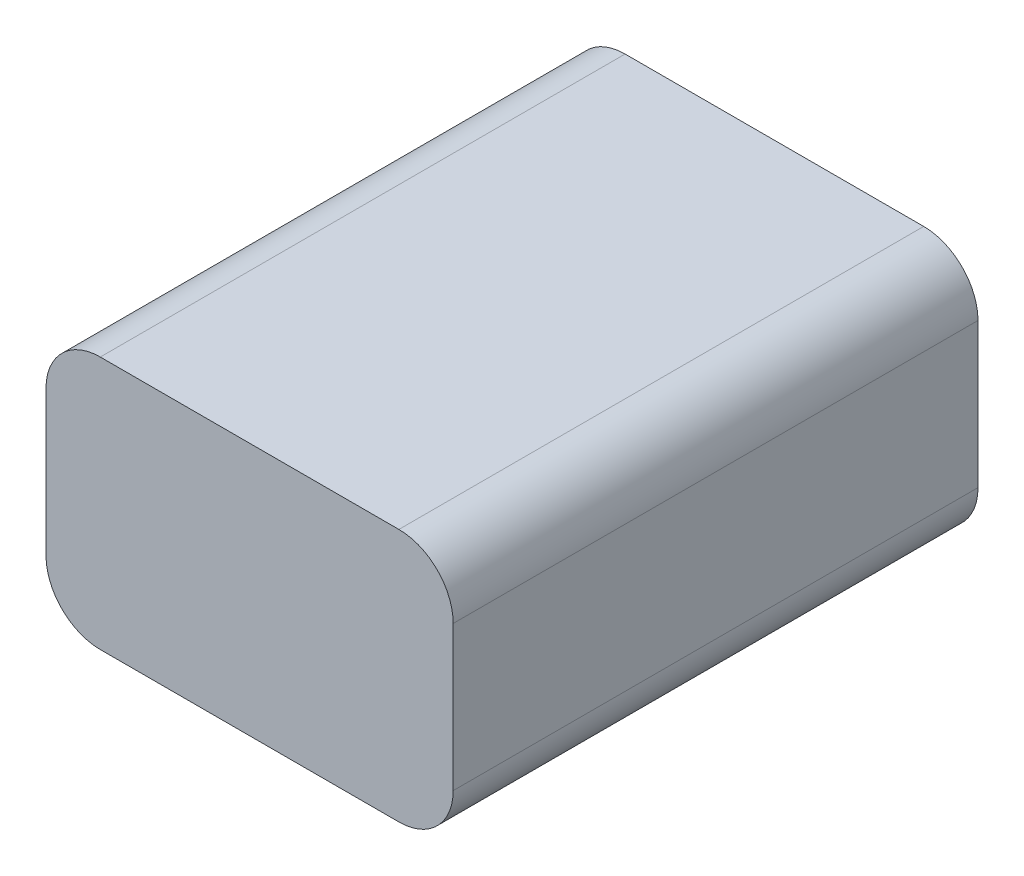
ISO-10303-21;
HEADER;
FILE_DESCRIPTION(('STEP AP214'),'2;1');
FILE_NAME('part.step','',(''),(''),'','','');
FILE_SCHEMA(('AUTOMOTIVE_DESIGN { 1 0 10303 214 1 1 1 1 }'));
ENDSEC;
DATA;
#1=APPLICATION_CONTEXT('core data for automotive mechanical design processes');
#2=APPLICATION_PROTOCOL_DEFINITION('international standard','automotive_design',2000,#1);
#3=PRODUCT_CONTEXT('',#1,'mechanical');
#4=PRODUCT('Part','Part','',(#3));
#5=PRODUCT_RELATED_PRODUCT_CATEGORY('part','',(#4));
#6=PRODUCT_DEFINITION_FORMATION('','',#4);
#7=PRODUCT_DEFINITION_CONTEXT('part definition',#1,'design');
#8=PRODUCT_DEFINITION('design','',#6,#7);
#9=PRODUCT_DEFINITION_SHAPE('','',#8);
#10=(LENGTH_UNIT() NAMED_UNIT(*) SI_UNIT(.MILLI.,.METRE.));
#11=(NAMED_UNIT(*) PLANE_ANGLE_UNIT() SI_UNIT($,.RADIAN.));
#12=(NAMED_UNIT(*) SI_UNIT($,.STERADIAN.) SOLID_ANGLE_UNIT());
#13=UNCERTAINTY_MEASURE_WITH_UNIT(LENGTH_MEASURE(1.E-05),#10,'distance_accuracy_value','');
#14=(GEOMETRIC_REPRESENTATION_CONTEXT(3) GLOBAL_UNCERTAINTY_ASSIGNED_CONTEXT((#13)) GLOBAL_UNIT_ASSIGNED_CONTEXT((#10,
#11,#12)) REPRESENTATION_CONTEXT('',''));
#15=CARTESIAN_POINT('',(0.,0.,0.));
#16=DIRECTION('',(0.,0.,1.));
#17=DIRECTION('',(1.,0.,0.));
#18=AXIS2_PLACEMENT_3D('',#15,#16,#17);
#19=CARTESIAN_POINT('',(22.5,14.,-29.));
#20=DIRECTION('',(1.,0.,0.));
#21=DIRECTION('',(0.,1.,0.));
#22=AXIS2_PLACEMENT_3D('',#19,#20,#21);
#23=PLANE('',#22);
#24=DIRECTION('',(0.,1.,0.));
#25=VECTOR('',#24,1.);
#26=CARTESIAN_POINT('',(22.5,14.,29.));
#27=LINE('',#26,#25);
#28=CARTESIAN_POINT('',(22.5,-8.,29.));
#29=VERTEX_POINT('',#28);
#30=CARTESIAN_POINT('',(22.5,8.,29.));
#31=VERTEX_POINT('',#30);
#32=EDGE_CURVE('E157',#29,#31,#27,.T.);
#33=ORIENTED_EDGE('',*,*,#32,.F.);
#34=DIRECTION('',(0.,0.,1.));
#35=VECTOR('',#34,1.);
#36=CARTESIAN_POINT('',(22.5,-8.,-29.));
#37=LINE('',#36,#35);
#38=CARTESIAN_POINT('',(22.5,-8.,-29.));
#39=VERTEX_POINT('',#38);
#40=EDGE_CURVE('E145',#29,#39,#37,.F.);
#41=ORIENTED_EDGE('',*,*,#40,.T.);
#42=DIRECTION('',(0.,1.,0.));
#43=VECTOR('',#42,1.);
#44=CARTESIAN_POINT('',(22.5,14.,-29.));
#45=LINE('',#44,#43);
#46=CARTESIAN_POINT('',(22.5,8.,-29.));
#47=VERTEX_POINT('',#46);
#48=EDGE_CURVE('E149',#39,#47,#45,.T.);
#49=ORIENTED_EDGE('',*,*,#48,.T.);
#50=DIRECTION('',(0.,0.,1.));
#51=VECTOR('',#50,1.);
#52=CARTESIAN_POINT('',(22.5,8.,-29.));
#53=LINE('',#52,#51);
#54=EDGE_CURVE('E142',#47,#31,#53,.T.);
#55=ORIENTED_EDGE('',*,*,#54,.T.);
#56=EDGE_LOOP('',(#33,#41,#49,#55));
#57=FACE_BOUND('',#56,.T.);
#58=ADVANCED_FACE('F32',(#57),#23,.T.);
#59=CARTESIAN_POINT('',(-22.5,-14.,-29.));
#60=DIRECTION('',(0.,-1.,0.));
#61=DIRECTION('',(0.,0.,-1.));
#62=AXIS2_PLACEMENT_3D('',#59,#60,#61);
#63=PLANE('',#62);
#64=DIRECTION('',(1.,0.,0.));
#65=VECTOR('',#64,1.);
#66=CARTESIAN_POINT('',(-22.5,-14.,29.));
#67=LINE('',#66,#65);
#68=CARTESIAN_POINT('',(-16.5,-14.,29.));
#69=VERTEX_POINT('',#68);
#70=CARTESIAN_POINT('',(16.5,-14.,29.));
#71=VERTEX_POINT('',#70);
#72=EDGE_CURVE('E115',#69,#71,#67,.T.);
#73=ORIENTED_EDGE('',*,*,#72,.F.);
#74=DIRECTION('',(0.,0.,1.));
#75=VECTOR('',#74,1.);
#76=CARTESIAN_POINT('',(-16.5,-14.,-29.));
#77=LINE('',#76,#75);
#78=CARTESIAN_POINT('',(-16.5,-14.,-29.));
#79=VERTEX_POINT('',#78);
#80=EDGE_CURVE('E133',#69,#79,#77,.F.);
#81=ORIENTED_EDGE('',*,*,#80,.T.);
#82=DIRECTION('',(1.,0.,0.));
#83=VECTOR('',#82,1.);
#84=CARTESIAN_POINT('',(-22.5,-14.,-29.));
#85=LINE('',#84,#83);
#86=CARTESIAN_POINT('',(16.5,-14.,-29.));
#87=VERTEX_POINT('',#86);
#88=EDGE_CURVE('E117',#79,#87,#85,.T.);
#89=ORIENTED_EDGE('',*,*,#88,.T.);
#90=DIRECTION('',(0.,0.,1.));
#91=VECTOR('',#90,1.);
#92=CARTESIAN_POINT('',(16.5,-14.,-29.));
#93=LINE('',#92,#91);
#94=EDGE_CURVE('E130',#87,#71,#93,.T.);
#95=ORIENTED_EDGE('',*,*,#94,.T.);
#96=EDGE_LOOP('',(#73,#81,#89,#95));
#97=FACE_BOUND('',#96,.T.);
#98=ADVANCED_FACE('F173',(#97),#63,.T.);
#99=CARTESIAN_POINT('',(-22.5,14.,-29.));
#100=DIRECTION('',(-1.,0.,0.));
#101=DIRECTION('',(0.,-1.,0.));
#102=AXIS2_PLACEMENT_3D('',#99,#100,#101);
#103=PLANE('',#102);
#104=DIRECTION('',(0.,-1.,0.));
#105=VECTOR('',#104,1.);
#106=CARTESIAN_POINT('',(-22.5,14.,-29.));
#107=LINE('',#106,#105);
#108=CARTESIAN_POINT('',(-22.5,8.,-29.));
#109=VERTEX_POINT('',#108);
#110=CARTESIAN_POINT('',(-22.5,-8.,-29.));
#111=VERTEX_POINT('',#110);
#112=EDGE_CURVE('E121',#109,#111,#107,.T.);
#113=ORIENTED_EDGE('',*,*,#112,.T.);
#114=DIRECTION('',(0.,0.,1.));
#115=VECTOR('',#114,1.);
#116=CARTESIAN_POINT('',(-22.5,-8.,-29.));
#117=LINE('',#116,#115);
#118=CARTESIAN_POINT('',(-22.5,-8.,29.));
#119=VERTEX_POINT('',#118);
#120=EDGE_CURVE('E107',#111,#119,#117,.T.);
#121=ORIENTED_EDGE('',*,*,#120,.T.);
#122=DIRECTION('',(0.,-1.,0.));
#123=VECTOR('',#122,1.);
#124=CARTESIAN_POINT('',(-22.5,14.,29.));
#125=LINE('',#124,#123);
#126=CARTESIAN_POINT('',(-22.5,8.,29.));
#127=VERTEX_POINT('',#126);
#128=EDGE_CURVE('E100',#127,#119,#125,.T.);
#129=ORIENTED_EDGE('',*,*,#128,.F.);
#130=DIRECTION('',(0.,0.,1.));
#131=VECTOR('',#130,1.);
#132=CARTESIAN_POINT('',(-22.5,8.,-29.));
#133=LINE('',#132,#131);
#134=EDGE_CURVE('E113',#127,#109,#133,.F.);
#135=ORIENTED_EDGE('',*,*,#134,.T.);
#136=EDGE_LOOP('',(#113,#121,#129,#135));
#137=FACE_BOUND('',#136,.T.);
#138=ADVANCED_FACE('F112',(#137),#103,.T.);
#139=CARTESIAN_POINT('',(-22.5,14.,-29.));
#140=DIRECTION('',(0.,1.,0.));
#141=DIRECTION('',(0.,0.,1.));
#142=AXIS2_PLACEMENT_3D('',#139,#140,#141);
#143=PLANE('',#142);
#144=DIRECTION('',(-1.,0.,0.));
#145=VECTOR('',#144,1.);
#146=CARTESIAN_POINT('',(-22.5,14.,29.));
#147=LINE('',#146,#145);
#148=CARTESIAN_POINT('',(16.5,14.,29.));
#149=VERTEX_POINT('',#148);
#150=CARTESIAN_POINT('',(-16.5,14.,29.));
#151=VERTEX_POINT('',#150);
#152=EDGE_CURVE('E101',#149,#151,#147,.T.);
#153=ORIENTED_EDGE('',*,*,#152,.F.);
#154=DIRECTION('',(0.,0.,1.));
#155=VECTOR('',#154,1.);
#156=CARTESIAN_POINT('',(16.5,14.,-29.));
#157=LINE('',#156,#155);
#158=CARTESIAN_POINT('',(16.5,14.,-29.));
#159=VERTEX_POINT('',#158);
#160=EDGE_CURVE('E11',#149,#159,#157,.F.);
#161=ORIENTED_EDGE('',*,*,#160,.T.);
#162=DIRECTION('',(-1.,0.,0.));
#163=VECTOR('',#162,1.);
#164=CARTESIAN_POINT('',(-22.5,14.,-29.));
#165=LINE('',#164,#163);
#166=CARTESIAN_POINT('',(-16.5,14.,-29.));
#167=VERTEX_POINT('',#166);
#168=EDGE_CURVE('E147',#159,#167,#165,.T.);
#169=ORIENTED_EDGE('',*,*,#168,.T.);
#170=DIRECTION('',(0.,0.,1.));
#171=VECTOR('',#170,1.);
#172=CARTESIAN_POINT('',(-16.5,14.,-29.));
#173=LINE('',#172,#171);
#174=EDGE_CURVE('E40',#167,#151,#173,.T.);
#175=ORIENTED_EDGE('',*,*,#174,.T.);
#176=EDGE_LOOP('',(#153,#161,#169,#175));
#177=FACE_BOUND('',#176,.T.);
#178=ADVANCED_FACE('F146',(#177),#143,.T.);
#179=CARTESIAN_POINT('',(0.,0.,-29.));
#180=DIRECTION('',(0.,0.,1.));
#181=DIRECTION('',(1.,0.,0.));
#182=AXIS2_PLACEMENT_3D('',#179,#180,#181);
#183=PLANE('',#182);
#184=ORIENTED_EDGE('',*,*,#88,.F.);
#185=CARTESIAN_POINT('',(-16.5,-8.,-29.));
#186=DIRECTION('',(0.,0.,1.));
#187=DIRECTION('',(1.,0.,0.));
#188=AXIS2_PLACEMENT_3D('',#185,#186,#187);
#189=CIRCLE('',#188,6.);
#190=EDGE_CURVE('E140',#79,#111,#189,.F.);
#191=ORIENTED_EDGE('',*,*,#190,.T.);
#192=ORIENTED_EDGE('',*,*,#112,.F.);
#193=CARTESIAN_POINT('',(-16.5,8.,-29.));
#194=DIRECTION('',(0.,0.,1.));
#195=DIRECTION('',(1.,0.,0.));
#196=AXIS2_PLACEMENT_3D('',#193,#194,#195);
#197=CIRCLE('',#196,6.);
#198=EDGE_CURVE('E47',#109,#167,#197,.F.);
#199=ORIENTED_EDGE('',*,*,#198,.T.);
#200=ORIENTED_EDGE('',*,*,#168,.F.);
#201=CARTESIAN_POINT('',(16.5,8.,-29.));
#202=DIRECTION('',(0.,0.,1.));
#203=DIRECTION('',(1.,0.,0.));
#204=AXIS2_PLACEMENT_3D('',#201,#202,#203);
#205=CIRCLE('',#204,6.);
#206=EDGE_CURVE('E136',#159,#47,#205,.F.);
#207=ORIENTED_EDGE('',*,*,#206,.T.);
#208=ORIENTED_EDGE('',*,*,#48,.F.);
#209=CARTESIAN_POINT('',(16.5,-8.,-29.));
#210=DIRECTION('',(0.,0.,1.));
#211=DIRECTION('',(1.,0.,0.));
#212=AXIS2_PLACEMENT_3D('',#209,#210,#211);
#213=CIRCLE('',#212,6.);
#214=EDGE_CURVE('E138',#39,#87,#213,.F.);
#215=ORIENTED_EDGE('',*,*,#214,.T.);
#216=EDGE_LOOP('',(#184,#191,#192,#199,#200,#207,#208,#215));
#217=FACE_BOUND('',#216,.T.);
#218=ADVANCED_FACE('F169',(#217),#183,.F.);
#219=CARTESIAN_POINT('',(0.,0.,29.));
#220=DIRECTION('',(0.,0.,1.));
#221=DIRECTION('',(1.,0.,0.));
#222=AXIS2_PLACEMENT_3D('',#219,#220,#221);
#223=PLANE('',#222);
#224=ORIENTED_EDGE('',*,*,#128,.T.);
#225=CARTESIAN_POINT('',(-16.5,-8.,29.));
#226=DIRECTION('',(0.,0.,1.));
#227=DIRECTION('',(1.,0.,0.));
#228=AXIS2_PLACEMENT_3D('',#225,#226,#227);
#229=CIRCLE('',#228,6.);
#230=EDGE_CURVE('E128',#119,#69,#229,.T.);
#231=ORIENTED_EDGE('',*,*,#230,.T.);
#232=ORIENTED_EDGE('',*,*,#72,.T.);
#233=CARTESIAN_POINT('',(16.5,-8.,29.));
#234=DIRECTION('',(0.,0.,1.));
#235=DIRECTION('',(1.,0.,0.));
#236=AXIS2_PLACEMENT_3D('',#233,#234,#235);
#237=CIRCLE('',#236,6.);
#238=EDGE_CURVE('E126',#71,#29,#237,.T.);
#239=ORIENTED_EDGE('',*,*,#238,.T.);
#240=ORIENTED_EDGE('',*,*,#32,.T.);
#241=CARTESIAN_POINT('',(16.5,8.,29.));
#242=DIRECTION('',(0.,0.,1.));
#243=DIRECTION('',(1.,0.,0.));
#244=AXIS2_PLACEMENT_3D('',#241,#242,#243);
#245=CIRCLE('',#244,6.);
#246=EDGE_CURVE('E106',#31,#149,#245,.T.);
#247=ORIENTED_EDGE('',*,*,#246,.T.);
#248=ORIENTED_EDGE('',*,*,#152,.T.);
#249=CARTESIAN_POINT('',(-16.5,8.,29.));
#250=DIRECTION('',(0.,0.,1.));
#251=DIRECTION('',(1.,0.,0.));
#252=AXIS2_PLACEMENT_3D('',#249,#250,#251);
#253=CIRCLE('',#252,6.);
#254=EDGE_CURVE('E97',#151,#127,#253,.T.);
#255=ORIENTED_EDGE('',*,*,#254,.T.);
#256=EDGE_LOOP('',(#224,#231,#232,#239,#240,#247,#248,#255));
#257=FACE_BOUND('',#256,.T.);
#258=ADVANCED_FACE('F99',(#257),#223,.T.);
#259=CARTESIAN_POINT('',(-16.5,-8.,-29.));
#260=DIRECTION('',(0.,0.,1.));
#261=DIRECTION('',(1.,0.,0.));
#262=AXIS2_PLACEMENT_3D('',#259,#260,#261);
#263=CYLINDRICAL_SURFACE('',#262,6.);
#264=ORIENTED_EDGE('',*,*,#190,.F.);
#265=ORIENTED_EDGE('',*,*,#80,.F.);
#266=ORIENTED_EDGE('',*,*,#230,.F.);
#267=ORIENTED_EDGE('',*,*,#120,.F.);
#268=EDGE_LOOP('',(#264,#265,#266,#267));
#269=FACE_BOUND('',#268,.T.);
#270=ADVANCED_FACE('F176',(#269),#263,.T.);
#271=CARTESIAN_POINT('',(16.5,-8.,-29.));
#272=DIRECTION('',(0.,0.,1.));
#273=DIRECTION('',(1.,0.,0.));
#274=AXIS2_PLACEMENT_3D('',#271,#272,#273);
#275=CYLINDRICAL_SURFACE('',#274,6.);
#276=ORIENTED_EDGE('',*,*,#214,.F.);
#277=ORIENTED_EDGE('',*,*,#40,.F.);
#278=ORIENTED_EDGE('',*,*,#238,.F.);
#279=ORIENTED_EDGE('',*,*,#94,.F.);
#280=EDGE_LOOP('',(#276,#277,#278,#279));
#281=FACE_BOUND('',#280,.T.);
#282=ADVANCED_FACE('F166',(#281),#275,.T.);
#283=CARTESIAN_POINT('',(16.5,8.,-29.));
#284=DIRECTION('',(0.,0.,1.));
#285=DIRECTION('',(1.,0.,0.));
#286=AXIS2_PLACEMENT_3D('',#283,#284,#285);
#287=CYLINDRICAL_SURFACE('',#286,6.);
#288=ORIENTED_EDGE('',*,*,#206,.F.);
#289=ORIENTED_EDGE('',*,*,#160,.F.);
#290=ORIENTED_EDGE('',*,*,#246,.F.);
#291=ORIENTED_EDGE('',*,*,#54,.F.);
#292=EDGE_LOOP('',(#288,#289,#290,#291));
#293=FACE_BOUND('',#292,.T.);
#294=ADVANCED_FACE('F183',(#293),#287,.T.);
#295=CARTESIAN_POINT('',(-16.5,8.,-29.));
#296=DIRECTION('',(0.,0.,1.));
#297=DIRECTION('',(1.,0.,0.));
#298=AXIS2_PLACEMENT_3D('',#295,#296,#297);
#299=CYLINDRICAL_SURFACE('',#298,6.);
#300=ORIENTED_EDGE('',*,*,#198,.F.);
#301=ORIENTED_EDGE('',*,*,#134,.F.);
#302=ORIENTED_EDGE('',*,*,#254,.F.);
#303=ORIENTED_EDGE('',*,*,#174,.F.);
#304=EDGE_LOOP('',(#300,#301,#302,#303));
#305=FACE_BOUND('',#304,.T.);
#306=ADVANCED_FACE('F34',(#305),#299,.T.);
#307=CLOSED_SHELL('',(#58,#98,#138,#178,#218,#258,#270,#282,#294,#306));
#308=MANIFOLD_SOLID_BREP('B2',#307);
#309=ADVANCED_BREP_SHAPE_REPRESENTATION('',(#18,#308),#14);
#310=SHAPE_DEFINITION_REPRESENTATION(#9,#309);
ENDSEC;
END-ISO-10303-21;
